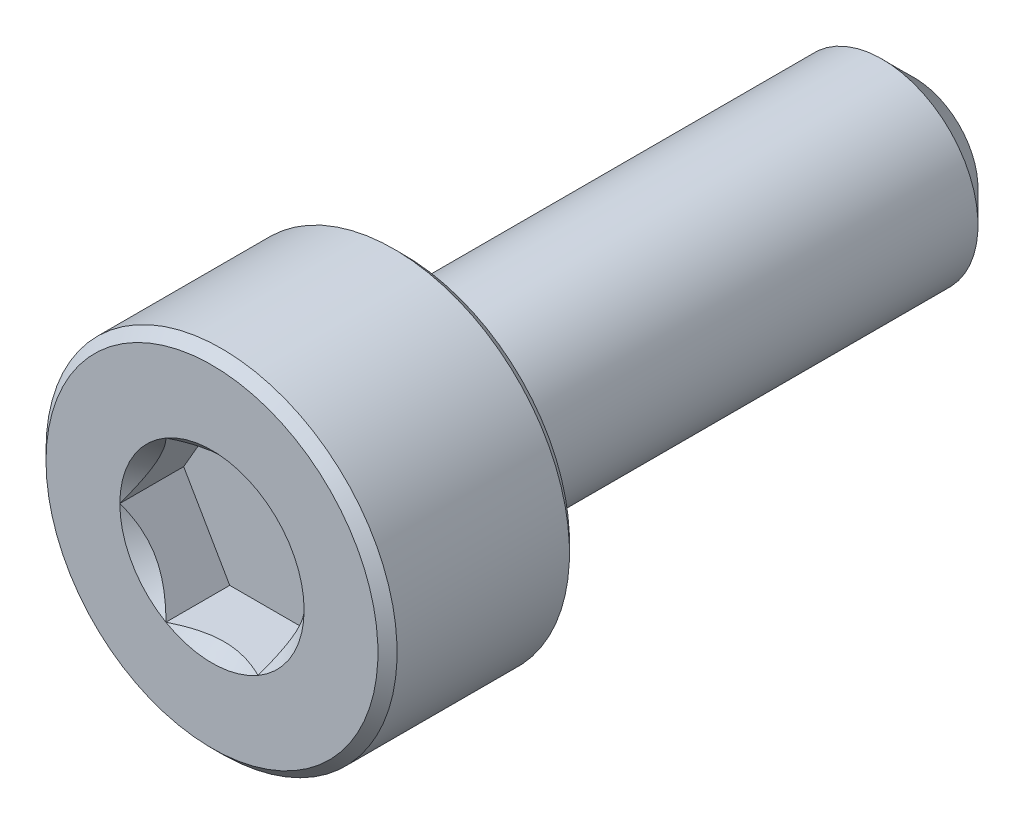
ISO-10303-21;
HEADER;
FILE_DESCRIPTION(('STEP AP214'),'2;1');
FILE_NAME('part.step','',(''),(''),'','','');
FILE_SCHEMA(('AUTOMOTIVE_DESIGN { 1 0 10303 214 1 1 1 1 }'));
ENDSEC;
DATA;
#1=APPLICATION_CONTEXT('core data for automotive mechanical design processes');
#2=APPLICATION_PROTOCOL_DEFINITION('international standard','automotive_design',2000,#1);
#3=PRODUCT_CONTEXT('',#1,'mechanical');
#4=PRODUCT('Part','Part','',(#3));
#5=PRODUCT_RELATED_PRODUCT_CATEGORY('part','',(#4));
#6=PRODUCT_DEFINITION_FORMATION('','',#4);
#7=PRODUCT_DEFINITION_CONTEXT('part definition',#1,'design');
#8=PRODUCT_DEFINITION('design','',#6,#7);
#9=PRODUCT_DEFINITION_SHAPE('','',#8);
#10=(LENGTH_UNIT() NAMED_UNIT(*) SI_UNIT(.MILLI.,.METRE.));
#11=(NAMED_UNIT(*) PLANE_ANGLE_UNIT() SI_UNIT($,.RADIAN.));
#12=(NAMED_UNIT(*) SI_UNIT($,.STERADIAN.) SOLID_ANGLE_UNIT());
#13=UNCERTAINTY_MEASURE_WITH_UNIT(LENGTH_MEASURE(1.E-05),#10,'distance_accuracy_value','');
#14=(GEOMETRIC_REPRESENTATION_CONTEXT(3) GLOBAL_UNCERTAINTY_ASSIGNED_CONTEXT((#13)) GLOBAL_UNIT_ASSIGNED_CONTEXT((#10,
#11,#12)) REPRESENTATION_CONTEXT('',''));
#15=CARTESIAN_POINT('',(0.,0.,0.));
#16=DIRECTION('',(0.,0.,1.));
#17=DIRECTION('',(1.,0.,0.));
#18=AXIS2_PLACEMENT_3D('',#15,#16,#17);
#19=CARTESIAN_POINT('',(0.,2.6,5.5));
#20=DIRECTION('',(0.,0.,1.));
#21=DIRECTION('',(1.,0.,0.));
#22=AXIS2_PLACEMENT_3D('',#19,#20,#21);
#23=PLANE('',#22);
#24=CARTESIAN_POINT('',(0.,0.,5.5));
#25=DIRECTION('',(0.,0.,1.));
#26=DIRECTION('',(1.,0.,0.));
#27=AXIS2_PLACEMENT_3D('',#24,#25,#26);
#28=CIRCLE('',#27,1.44337567297406);
#29=CARTESIAN_POINT('',(1.44337567297406,0.,5.5));
#30=VERTEX_POINT('',#29);
#31=CARTESIAN_POINT('',(0.721687836487031,1.25,5.5));
#32=VERTEX_POINT('',#31);
#33=EDGE_CURVE('E97',#30,#32,#28,.T.);
#34=ORIENTED_EDGE('',*,*,#33,.F.);
#35=CARTESIAN_POINT('',(0.721687836487031,-1.25,5.5));
#36=VERTEX_POINT('',#35);
#37=EDGE_CURVE('E57',#36,#30,#28,.T.);
#38=ORIENTED_EDGE('',*,*,#37,.F.);
#39=CARTESIAN_POINT('',(-0.721687836487033,-1.25,5.5));
#40=VERTEX_POINT('',#39);
#41=EDGE_CURVE('E300',#40,#36,#28,.T.);
#42=ORIENTED_EDGE('',*,*,#41,.F.);
#43=CARTESIAN_POINT('',(-1.44337567297406,0.,5.5));
#44=VERTEX_POINT('',#43);
#45=EDGE_CURVE('E64',#44,#40,#28,.T.);
#46=ORIENTED_EDGE('',*,*,#45,.F.);
#47=CARTESIAN_POINT('',(-0.721687836487031,1.25,5.5));
#48=VERTEX_POINT('',#47);
#49=EDGE_CURVE('E132',#48,#44,#28,.T.);
#50=ORIENTED_EDGE('',*,*,#49,.F.);
#51=EDGE_CURVE('E106',#32,#48,#28,.T.);
#52=ORIENTED_EDGE('',*,*,#51,.F.);
#53=EDGE_LOOP('',(#34,#38,#42,#46,#50,#52));
#54=FACE_BOUND('',#53,.T.);
#55=CARTESIAN_POINT('',(0.,0.,5.5));
#56=DIRECTION('',(0.,0.,-1.));
#57=DIRECTION('',(-1.,0.,0.));
#58=AXIS2_PLACEMENT_3D('',#55,#56,#57);
#59=CIRCLE('',#58,2.6);
#60=CARTESIAN_POINT('',(-2.6,0.,5.5));
#61=VERTEX_POINT('',#60);
#62=EDGE_CURVE('E51',#61,#61,#59,.T.);
#63=ORIENTED_EDGE('',*,*,#62,.F.);
#64=EDGE_LOOP('',(#63));
#65=FACE_BOUND('',#64,.T.);
#66=ADVANCED_FACE('F38',(#54,#65),#23,.T.);
#67=CARTESIAN_POINT('',(0.,0.,5.35));
#68=DIRECTION('',(0.,0.,-1.));
#69=DIRECTION('',(-1.,0.,0.));
#70=AXIS2_PLACEMENT_3D('',#67,#68,#69);
#71=CONICAL_SURFACE('',#70,2.75,0.785398163397445);
#72=ORIENTED_EDGE('',*,*,#62,.T.);
#73=EDGE_LOOP('',(#72));
#74=FACE_BOUND('',#73,.T.);
#75=CARTESIAN_POINT('',(0.,0.,5.35));
#76=DIRECTION('',(0.,0.,-1.));
#77=DIRECTION('',(-1.,0.,0.));
#78=AXIS2_PLACEMENT_3D('',#75,#76,#77);
#79=CIRCLE('',#78,2.75);
#80=CARTESIAN_POINT('',(-2.75,0.,5.35));
#81=VERTEX_POINT('',#80);
#82=EDGE_CURVE('E275',#81,#81,#79,.T.);
#83=ORIENTED_EDGE('',*,*,#82,.F.);
#84=EDGE_LOOP('',(#83));
#85=FACE_BOUND('',#84,.T.);
#86=ADVANCED_FACE('F196',(#74,#85),#71,.T.);
#87=CARTESIAN_POINT('',(0.,0.,-5.5));
#88=DIRECTION('',(0.,0.,-1.));
#89=DIRECTION('',(-1.,0.,0.));
#90=AXIS2_PLACEMENT_3D('',#87,#88,#89);
#91=CYLINDRICAL_SURFACE('',#90,2.75);
#92=ORIENTED_EDGE('',*,*,#82,.T.);
#93=EDGE_LOOP('',(#92));
#94=FACE_BOUND('',#93,.T.);
#95=CARTESIAN_POINT('',(0.,0.,2.65));
#96=DIRECTION('',(0.,0.,-1.));
#97=DIRECTION('',(-1.,0.,0.));
#98=AXIS2_PLACEMENT_3D('',#95,#96,#97);
#99=CIRCLE('',#98,2.75);
#100=CARTESIAN_POINT('',(-2.75,0.,2.65));
#101=VERTEX_POINT('',#100);
#102=EDGE_CURVE('E272',#101,#101,#99,.T.);
#103=ORIENTED_EDGE('',*,*,#102,.F.);
#104=EDGE_LOOP('',(#103));
#105=FACE_BOUND('',#104,.T.);
#106=ADVANCED_FACE('F200',(#94,#105),#91,.T.);
#107=CARTESIAN_POINT('',(0.,0.,2.5));
#108=DIRECTION('',(0.,0.,1.));
#109=DIRECTION('',(1.,0.,0.));
#110=AXIS2_PLACEMENT_3D('',#107,#108,#109);
#111=CONICAL_SURFACE('',#110,2.6,0.785398163397445);
#112=ORIENTED_EDGE('',*,*,#102,.T.);
#113=EDGE_LOOP('',(#112));
#114=FACE_BOUND('',#113,.T.);
#115=CARTESIAN_POINT('',(0.,0.,2.5));
#116=DIRECTION('',(0.,0.,-1.));
#117=DIRECTION('',(-1.,0.,0.));
#118=AXIS2_PLACEMENT_3D('',#115,#116,#117);
#119=CIRCLE('',#118,2.6);
#120=CARTESIAN_POINT('',(-2.6,0.,2.5));
#121=VERTEX_POINT('',#120);
#122=EDGE_CURVE('E269',#121,#121,#119,.T.);
#123=ORIENTED_EDGE('',*,*,#122,.F.);
#124=EDGE_LOOP('',(#123));
#125=FACE_BOUND('',#124,.T.);
#126=ADVANCED_FACE('F205',(#114,#125),#111,.T.);
#127=CARTESIAN_POINT('',(0.,2.6,2.5));
#128=DIRECTION('',(0.,0.,-1.));
#129=DIRECTION('',(-1.,0.,0.));
#130=AXIS2_PLACEMENT_3D('',#127,#128,#129);
#131=PLANE('',#130);
#132=ORIENTED_EDGE('',*,*,#122,.T.);
#133=EDGE_LOOP('',(#132));
#134=FACE_BOUND('',#133,.T.);
#135=CARTESIAN_POINT('',(0.,0.,2.5));
#136=DIRECTION('',(0.,0.,-1.));
#137=DIRECTION('',(-1.,0.,0.));
#138=AXIS2_PLACEMENT_3D('',#135,#136,#137);
#139=CIRCLE('',#138,1.5);
#140=CARTESIAN_POINT('',(-1.5,0.,2.5));
#141=VERTEX_POINT('',#140);
#142=EDGE_CURVE('E266',#141,#141,#139,.T.);
#143=ORIENTED_EDGE('',*,*,#142,.F.);
#144=EDGE_LOOP('',(#143));
#145=FACE_BOUND('',#144,.T.);
#146=ADVANCED_FACE('F213',(#134,#145),#131,.T.);
#147=CARTESIAN_POINT('',(0.,0.,-5.5));
#148=DIRECTION('',(0.,0.,-1.));
#149=DIRECTION('',(-1.,0.,0.));
#150=AXIS2_PLACEMENT_3D('',#147,#148,#149);
#151=CYLINDRICAL_SURFACE('',#150,1.5);
#152=ORIENTED_EDGE('',*,*,#142,.T.);
#153=EDGE_LOOP('',(#152));
#154=FACE_BOUND('',#153,.T.);
#155=CARTESIAN_POINT('',(0.,0.,-4.99999999999999));
#156=DIRECTION('',(0.,0.,-1.));
#157=DIRECTION('',(-1.,0.,0.));
#158=AXIS2_PLACEMENT_3D('',#155,#156,#157);
#159=CIRCLE('',#158,1.5);
#160=CARTESIAN_POINT('',(-1.5,0.,-4.99999999999999));
#161=VERTEX_POINT('',#160);
#162=EDGE_CURVE('E263',#161,#161,#159,.T.);
#163=ORIENTED_EDGE('',*,*,#162,.F.);
#164=EDGE_LOOP('',(#163));
#165=FACE_BOUND('',#164,.T.);
#166=ADVANCED_FACE('F217',(#154,#165),#151,.T.);
#167=CARTESIAN_POINT('',(0.,0.,-5.5));
#168=DIRECTION('',(0.,0.,1.));
#169=DIRECTION('',(1.,0.,0.));
#170=AXIS2_PLACEMENT_3D('',#167,#168,#169);
#171=CONICAL_SURFACE('',#170,1.,0.785398163397443);
#172=ORIENTED_EDGE('',*,*,#162,.T.);
#173=EDGE_LOOP('',(#172));
#174=FACE_BOUND('',#173,.T.);
#175=CARTESIAN_POINT('',(0.,0.,-5.5));
#176=DIRECTION('',(0.,0.,-1.));
#177=DIRECTION('',(-1.,0.,0.));
#178=AXIS2_PLACEMENT_3D('',#175,#176,#177);
#179=CIRCLE('',#178,1.);
#180=CARTESIAN_POINT('',(-1.,0.,-5.5));
#181=VERTEX_POINT('',#180);
#182=EDGE_CURVE('E245',#181,#181,#179,.T.);
#183=ORIENTED_EDGE('',*,*,#182,.F.);
#184=EDGE_LOOP('',(#183));
#185=FACE_BOUND('',#184,.T.);
#186=ADVANCED_FACE('F221',(#174,#185),#171,.T.);
#187=CARTESIAN_POINT('',(0.,1.,-5.5));
#188=DIRECTION('',(0.,0.,-1.));
#189=DIRECTION('',(-1.,0.,0.));
#190=AXIS2_PLACEMENT_3D('',#187,#188,#189);
#191=PLANE('',#190);
#192=ORIENTED_EDGE('',*,*,#182,.T.);
#193=EDGE_LOOP('',(#192));
#194=FACE_BOUND('',#193,.T.);
#195=ADVANCED_FACE('F225',(#194),#191,.T.);
#196=CARTESIAN_POINT('',(0.,0.,5.5));
#197=DIRECTION('',(0.,0.,1.));
#198=DIRECTION('',(1.,0.,0.));
#199=AXIS2_PLACEMENT_3D('',#196,#197,#198);
#200=CONICAL_SURFACE('',#199,1.44337567297406,0.78539816339745);
#201=ORIENTED_EDGE('',*,*,#51,.T.);
#202=CARTESIAN_POINT('',(-1.38510181874982,1.25,5.92237003539674));
#203=CARTESIAN_POINT('',(-1.3511198664462,1.25,5.89714624516244));
#204=CARTESIAN_POINT('',(-1.31694282655271,1.25,5.87218595606241));
#205=CARTESIAN_POINT('',(-1.24812142569207,1.25,5.82289946364711));
#206=CARTESIAN_POINT('',(-1.21347694388891,1.25,5.7985734292472));
#207=CARTESIAN_POINT('',(-1.10822083190006,1.25,5.72636172296323));
#208=CARTESIAN_POINT('',(-1.0368031370095,1.25,5.67963105585342));
#209=CARTESIAN_POINT('',(-0.887382773604422,1.25,5.58837288370571));
#210=CARTESIAN_POINT('',(-0.809230859559387,1.25,5.54408680019188));
#211=CARTESIAN_POINT('',(-0.649095969048192,1.25,5.46341771967474));
#212=CARTESIAN_POINT('',(-0.567127025311257,1.25,5.42700818355541));
#213=CARTESIAN_POINT('',(-0.443557329124525,1.25,5.38248253752399));
#214=CARTESIAN_POINT('',(-0.403672751095206,1.25,5.36961750878661));
#215=CARTESIAN_POINT('',(-0.322988211495524,1.25,5.34709732587493));
#216=CARTESIAN_POINT('',(-0.282188182544569,1.25,5.3374424088096));
#217=CARTESIAN_POINT('',(-0.200572984829334,1.25,5.32199119628927));
#218=CARTESIAN_POINT('',(-0.159769911270982,1.25,5.31613197729548));
#219=CARTESIAN_POINT('',(-0.0777868297167925,1.25,5.30837795442431));
#220=CARTESIAN_POINT('',(-0.0366068776776866,1.25,5.30648257131138));
#221=CARTESIAN_POINT('',(0.044468300338807,1.25,5.30677812948321));
#222=CARTESIAN_POINT('',(0.0843640386448807,1.25,5.3088450344818));
#223=CARTESIAN_POINT('',(0.16379054813703,1.25,5.31668957033969));
#224=CARTESIAN_POINT('',(0.203321244417683,1.25,5.32246794634046));
#225=CARTESIAN_POINT('',(0.282393987539772,1.25,5.33752741705993));
#226=CARTESIAN_POINT('',(0.321924895820598,1.25,5.34686615718743));
#227=CARTESIAN_POINT('',(0.400129026379049,1.25,5.36856655366507));
#228=CARTESIAN_POINT('',(0.438802337754634,1.25,5.38092789436938));
#229=CARTESIAN_POINT('',(0.563172797994067,1.25,5.42526147510656));
#230=CARTESIAN_POINT('',(0.647028634884197,1.25,5.46238856151275));
#231=CARTESIAN_POINT('',(0.810774513742064,1.25,5.54485212171168));
#232=CARTESIAN_POINT('',(0.890648634134941,1.25,5.59021863514241));
#233=CARTESIAN_POINT('',(1.04325497380786,1.25,5.68372168049333));
#234=CARTESIAN_POINT('',(1.11614441754118,1.25,5.73160472363706));
#235=CARTESIAN_POINT('',(1.22353403061444,1.25,5.8055883961688));
#236=CARTESIAN_POINT('',(1.25886568278664,1.25,5.83050307518733));
#237=CARTESIAN_POINT('',(1.32904842602817,1.25,5.8809811787098));
#238=CARTESIAN_POINT('',(1.36389964521094,1.25,5.90654442489043));
#239=CARTESIAN_POINT('',(1.39855118522491,1.25,5.93237628762573));
#240=B_SPLINE_CURVE_WITH_KNOTS('',3,(#202,#203,#204,#205,#206,#207,#208,#209,#210,#211,#212,
#213,#214,#215,#216,#217,#218,#219,#220,#221,#222,#223,#224,#225,#226,#227,#228,#229,#230,#231,
#232,#233,#234,#235,#236,#237,#238,#239),.UNSPECIFIED.,.F.,.F.,(4,2,2,2,2,2,2,2,2,2,2,2,2,2,2,2,
2,2,4),(0.,0.126957685716233,0.253948844536467,0.509869207561396,0.779115442456376,
1.04743984385779,1.17305649104353,1.29868241461005,1.42216852508156,1.54563658925964,
1.66530259813563,1.78499263952808,1.90670905530249,2.0284127658315,2.30272027123448,
2.57804870180744,2.83955157020837,2.96924487037104,3.0989028897939),.UNSPECIFIED.);
#241=EDGE_CURVE('E12',#32,#48,#240,.F.);
#242=ORIENTED_EDGE('',*,*,#241,.F.);
#243=EDGE_LOOP('',(#201,#242));
#244=FACE_BOUND('',#243,.T.);
#245=ADVANCED_FACE('F110',(#244),#200,.F.);
#246=ORIENTED_EDGE('',*,*,#49,.T.);
#247=CARTESIAN_POINT('',(-0.721572366433194,1.2502,5.50011548390914));
#248=CARTESIAN_POINT('',(-0.746384090710444,1.20722483292841,5.4753216680551));
#249=CARTESIAN_POINT('',(-0.771610739653664,1.16353099525405,5.45198373441868));
#250=CARTESIAN_POINT('',(-0.823050873919154,1.07443406915806,5.40925200408454));
#251=CARTESIAN_POINT('',(-0.849269254648333,1.02902250164294,5.38988199236041));
#252=CARTESIAN_POINT('',(-0.902137405038635,0.937452179064741,5.35670048341348));
#253=CARTESIAN_POINT('',(-0.928773701756387,0.891316759824116,5.34280555905266));
#254=CARTESIAN_POINT('',(-0.982632884076012,0.798029919592409,5.32139728216064));
#255=CARTESIAN_POINT('',(-1.00985412292348,0.750881350863622,5.31386794156679));
#256=CARTESIAN_POINT('',(-1.05676666578643,0.66962644311275,5.3070744980507));
#257=CARTESIAN_POINT('',(-1.07639733689152,0.635625123372061,5.30606855910435));
#258=CARTESIAN_POINT('',(-1.11562418145499,0.567682235567525,5.30776141491132));
#259=CARTESIAN_POINT('',(-1.1352203463451,0.533740682344345,5.31046102721554));
#260=CARTESIAN_POINT('',(-1.1742235548576,0.466185143542503,5.31940893031638));
#261=CARTESIAN_POINT('',(-1.19363040521232,0.432571492713227,5.32566052589971));
#262=CARTESIAN_POINT('',(-1.23212011385119,0.365905361782189,5.3413756814139));
#263=CARTESIAN_POINT('',(-1.2512028293628,0.332853128969707,5.35084062008746));
#264=CARTESIAN_POINT('',(-1.30007715810653,0.248200308399738,5.37893139068759));
#265=CARTESIAN_POINT('',(-1.32956058931202,0.197133507570364,5.3996701574522));
#266=CARTESIAN_POINT('',(-1.38737318998519,0.0969991458867465,5.44638713467148));
#267=CARTESIAN_POINT('',(-1.41570576386268,0.0479256884217316,5.47234829594677));
#268=CARTESIAN_POINT('',(-1.4434911430279,-0.000199999999999488,5.50011548390914));
#269=B_SPLINE_CURVE_WITH_KNOTS('',3,(#247,#248,#249,#250,#251,#252,#253,#254,#255,#256,#257,
#258,#259,#260,#261,#262,#263,#264,#265,#266,#267,#268),.UNSPECIFIED.,.F.,.F.,(4,2,2,2,2,2,2,2,
2,2,4),(0.,0.166533409618303,0.334037607289761,0.498880396489697,0.663307919240272,
0.780963963458824,0.89864597014845,1.01643764860773,1.13427993171549,1.32148652032141,
1.50809158792573),.UNSPECIFIED.);
#270=EDGE_CURVE('E105',#48,#44,#269,.T.);
#271=ORIENTED_EDGE('',*,*,#270,.F.);
#272=EDGE_LOOP('',(#246,#271));
#273=FACE_BOUND('',#272,.T.);
#274=ADVANCED_FACE('F308',(#273),#200,.F.);
#275=ORIENTED_EDGE('',*,*,#45,.T.);
#276=CARTESIAN_POINT('',(-1.4434911430279,0.000200000000000513,5.50011548390914));
#277=CARTESIAN_POINT('',(-1.41867941875065,-0.0427751670715862,5.4753216680551));
#278=CARTESIAN_POINT('',(-1.39345276980743,-0.0864690047459475,5.45198373441868));
#279=CARTESIAN_POINT('',(-1.34201263554194,-0.175565930841941,5.40925200408454));
#280=CARTESIAN_POINT('',(-1.31579425481276,-0.220977498357064,5.38988199236041));
#281=CARTESIAN_POINT('',(-1.26292610442246,-0.312547820935259,5.35670048341348));
#282=CARTESIAN_POINT('',(-1.23628980770471,-0.358683240175885,5.34280555905266));
#283=CARTESIAN_POINT('',(-1.18243062538508,-0.451970080407592,5.32139728216064));
#284=CARTESIAN_POINT('',(-1.15520938653761,-0.499118649136379,5.31386794156679));
#285=CARTESIAN_POINT('',(-1.10829684367467,-0.580373556887252,5.3070744980507));
#286=CARTESIAN_POINT('',(-1.08866617256958,-0.614374876627941,5.30606855910435));
#287=CARTESIAN_POINT('',(-1.04943932800611,-0.682317764432477,5.30776141491132));
#288=CARTESIAN_POINT('',(-1.02984316311599,-0.716259317655657,5.31046102721554));
#289=CARTESIAN_POINT('',(-0.990839954603499,-0.783814856457499,5.31940893031638));
#290=CARTESIAN_POINT('',(-0.971433104248771,-0.817428507286775,5.32566052589971));
#291=CARTESIAN_POINT('',(-0.932943395609905,-0.884094638217813,5.3413756814139));
#292=CARTESIAN_POINT('',(-0.913860680098301,-0.917146871030295,5.35084062008746));
#293=CARTESIAN_POINT('',(-0.864986351354568,-1.00179969160026,5.37893139068759));
#294=CARTESIAN_POINT('',(-0.835502920149076,-1.05286649242964,5.3996701574522));
#295=CARTESIAN_POINT('',(-0.777690319475909,-1.15300085411325,5.44638713467148));
#296=CARTESIAN_POINT('',(-0.749357745598417,-1.20207431157827,5.47234829594677));
#297=CARTESIAN_POINT('',(-0.721572366433195,-1.2502,5.50011548390914));
#298=B_SPLINE_CURVE_WITH_KNOTS('',3,(#276,#277,#278,#279,#280,#281,#282,#283,#284,#285,#286,
#287,#288,#289,#290,#291,#292,#293,#294,#295,#296,#297),.UNSPECIFIED.,.F.,.F.,(4,2,2,2,2,2,2,2,
2,2,4),(0.,0.166533409618304,0.334037607289762,0.498880396489698,0.663307919240275,
0.780963963458827,0.898645970148453,1.01643764860773,1.1342799317155,1.32148652032141,
1.50809158792573),.UNSPECIFIED.);
#299=EDGE_CURVE('E141',#44,#40,#298,.T.);
#300=ORIENTED_EDGE('',*,*,#299,.F.);
#301=EDGE_LOOP('',(#275,#300));
#302=FACE_BOUND('',#301,.T.);
#303=ADVANCED_FACE('F303',(#302),#200,.F.);
#304=ORIENTED_EDGE('',*,*,#41,.T.);
#305=CARTESIAN_POINT('',(-1.38510181874983,-1.25,5.92237003539674));
#306=CARTESIAN_POINT('',(-1.3511198664462,-1.25,5.89714624516244));
#307=CARTESIAN_POINT('',(-1.31694282655271,-1.25,5.87218595606241));
#308=CARTESIAN_POINT('',(-1.24812142569207,-1.25,5.82289946364711));
#309=CARTESIAN_POINT('',(-1.21347694388891,-1.25,5.7985734292472));
#310=CARTESIAN_POINT('',(-1.10822083190006,-1.25,5.72636172296323));
#311=CARTESIAN_POINT('',(-1.0368031370095,-1.25,5.67963105585342));
#312=CARTESIAN_POINT('',(-0.887382773604422,-1.25,5.58837288370571));
#313=CARTESIAN_POINT('',(-0.809230859559387,-1.25,5.54408680019187));
#314=CARTESIAN_POINT('',(-0.649095969048193,-1.25,5.46341771967474));
#315=CARTESIAN_POINT('',(-0.567127025311257,-1.25,5.42700818355541));
#316=CARTESIAN_POINT('',(-0.443557329124525,-1.25,5.38248253752399));
#317=CARTESIAN_POINT('',(-0.403672751095206,-1.25,5.36961750878661));
#318=CARTESIAN_POINT('',(-0.322988211495524,-1.25,5.34709732587493));
#319=CARTESIAN_POINT('',(-0.28218818254457,-1.25,5.33744240880959));
#320=CARTESIAN_POINT('',(-0.200572984829335,-1.25,5.32199119628927));
#321=CARTESIAN_POINT('',(-0.159769911270982,-1.25,5.31613197729548));
#322=CARTESIAN_POINT('',(-0.077786829716793,-1.25,5.30837795442431));
#323=CARTESIAN_POINT('',(-0.0366068776776871,-1.25,5.30648257131138));
#324=CARTESIAN_POINT('',(0.0444683003388065,-1.25,5.30677812948321));
#325=CARTESIAN_POINT('',(0.0843640386448802,-1.25,5.3088450344818));
#326=CARTESIAN_POINT('',(0.16379054813703,-1.25,5.31668957033969));
#327=CARTESIAN_POINT('',(0.203321244417683,-1.25,5.32246794634046));
#328=CARTESIAN_POINT('',(0.282393987539771,-1.25,5.33752741705993));
#329=CARTESIAN_POINT('',(0.321924895820597,-1.25,5.34686615718743));
#330=CARTESIAN_POINT('',(0.400129026379048,-1.25,5.36856655366507));
#331=CARTESIAN_POINT('',(0.438802337754633,-1.25,5.38092789436938));
#332=CARTESIAN_POINT('',(0.563172797994066,-1.25,5.42526147510656));
#333=CARTESIAN_POINT('',(0.647028634884195,-1.25,5.46238856151275));
#334=CARTESIAN_POINT('',(0.810774513742062,-1.25,5.54485212171168));
#335=CARTESIAN_POINT('',(0.890648634134939,-1.25,5.5902186351424));
#336=CARTESIAN_POINT('',(1.04325497380785,-1.25,5.68372168049333));
#337=CARTESIAN_POINT('',(1.11614441754118,-1.25,5.73160472363706));
#338=CARTESIAN_POINT('',(1.22353403061444,-1.25,5.8055883961688));
#339=CARTESIAN_POINT('',(1.25886568278664,-1.25,5.83050307518733));
#340=CARTESIAN_POINT('',(1.32904842602817,-1.25,5.8809811787098));
#341=CARTESIAN_POINT('',(1.36389964521094,-1.25,5.90654442489043));
#342=CARTESIAN_POINT('',(1.3985511852249,-1.25,5.93237628762573));
#343=B_SPLINE_CURVE_WITH_KNOTS('',3,(#305,#306,#307,#308,#309,#310,#311,#312,#313,#314,#315,
#316,#317,#318,#319,#320,#321,#322,#323,#324,#325,#326,#327,#328,#329,#330,#331,#332,#333,#334,
#335,#336,#337,#338,#339,#340,#341,#342),.UNSPECIFIED.,.F.,.F.,(4,2,2,2,2,2,2,2,2,2,2,2,2,2,2,2,
2,2,4),(0.,0.126957685716233,0.253948844536467,0.509869207561397,0.779115442456378,
1.04743984385779,1.17305649104353,1.29868241461005,1.42216852508156,1.54563658925964,
1.66530259813563,1.78499263952808,1.90670905530249,2.0284127658315,2.30272027123448,
2.57804870180744,2.83955157020837,2.96924487037104,3.0989028897939),.UNSPECIFIED.);
#344=EDGE_CURVE('E161',#40,#36,#343,.T.);
#345=ORIENTED_EDGE('',*,*,#344,.F.);
#346=EDGE_LOOP('',(#304,#345));
#347=FACE_BOUND('',#346,.T.);
#348=ADVANCED_FACE('F301',(#347),#200,.F.);
#349=ORIENTED_EDGE('',*,*,#37,.T.);
#350=CARTESIAN_POINT('',(0.721572366433193,-1.2502,5.50011548390914));
#351=CARTESIAN_POINT('',(0.746384090710443,-1.20722483292841,5.4753216680551));
#352=CARTESIAN_POINT('',(0.771610739653663,-1.16353099525405,5.45198373441868));
#353=CARTESIAN_POINT('',(0.823050873919153,-1.07443406915806,5.40925200408454));
#354=CARTESIAN_POINT('',(0.849269254648332,-1.02902250164294,5.38988199236041));
#355=CARTESIAN_POINT('',(0.902137405038634,-0.93745217906474,5.35670048341348));
#356=CARTESIAN_POINT('',(0.928773701756385,-0.891316759824115,5.34280555905266));
#357=CARTESIAN_POINT('',(0.982632884076011,-0.798029919592408,5.32139728216064));
#358=CARTESIAN_POINT('',(1.00985412292348,-0.750881350863621,5.31386794156679));
#359=CARTESIAN_POINT('',(1.05676666578643,-0.669626443112749,5.3070744980507));
#360=CARTESIAN_POINT('',(1.07639733689152,-0.63562512337206,5.30606855910435));
#361=CARTESIAN_POINT('',(1.11562418145498,-0.567682235567524,5.30776141491132));
#362=CARTESIAN_POINT('',(1.1352203463451,-0.533740682344344,5.31046102721554));
#363=CARTESIAN_POINT('',(1.1742235548576,-0.466185143542502,5.31940893031638));
#364=CARTESIAN_POINT('',(1.19363040521232,-0.432571492713226,5.32566052589971));
#365=CARTESIAN_POINT('',(1.23212011385119,-0.365905361782188,5.3413756814139));
#366=CARTESIAN_POINT('',(1.25120282936279,-0.332853128969706,5.35084062008746));
#367=CARTESIAN_POINT('',(1.30007715810653,-0.248200308399737,5.37893139068759));
#368=CARTESIAN_POINT('',(1.32956058931202,-0.197133507570362,5.3996701574522));
#369=CARTESIAN_POINT('',(1.38737318998519,-0.096999145886745,5.44638713467147));
#370=CARTESIAN_POINT('',(1.41570576386268,-0.0479256884217301,5.47234829594676));
#371=CARTESIAN_POINT('',(1.4434911430279,0.00020000000000041,5.50011548390914));
#372=B_SPLINE_CURVE_WITH_KNOTS('',3,(#350,#351,#352,#353,#354,#355,#356,#357,#358,#359,#360,
#361,#362,#363,#364,#365,#366,#367,#368,#369,#370,#371),.UNSPECIFIED.,.F.,.F.,(4,2,2,2,2,2,2,2,
2,2,4),(0.,0.166533409618303,0.33403760728976,0.498880396489697,0.663307919240272,
0.780963963458824,0.89864597014845,1.01643764860773,1.13427993171549,1.32148652032141,
1.50809158792574),.UNSPECIFIED.);
#373=EDGE_CURVE('E122',#36,#30,#372,.T.);
#374=ORIENTED_EDGE('',*,*,#373,.F.);
#375=EDGE_LOOP('',(#349,#374));
#376=FACE_BOUND('',#375,.T.);
#377=ADVANCED_FACE('F154',(#376),#200,.F.);
#378=ORIENTED_EDGE('',*,*,#33,.T.);
#379=CARTESIAN_POINT('',(1.4434911430279,-0.000199999999999486,5.50011548390914));
#380=CARTESIAN_POINT('',(1.41867941875065,0.0427751670715871,5.4753216680551));
#381=CARTESIAN_POINT('',(1.39345276980743,0.0864690047459483,5.45198373441868));
#382=CARTESIAN_POINT('',(1.34201263554194,0.175565930841942,5.40925200408454));
#383=CARTESIAN_POINT('',(1.31579425481276,0.220977498357064,5.38988199236041));
#384=CARTESIAN_POINT('',(1.26292610442246,0.31254782093526,5.35670048341348));
#385=CARTESIAN_POINT('',(1.23628980770471,0.358683240175885,5.34280555905266));
#386=CARTESIAN_POINT('',(1.18243062538508,0.451970080407592,5.32139728216064));
#387=CARTESIAN_POINT('',(1.15520938653761,0.499118649136379,5.31386794156679));
#388=CARTESIAN_POINT('',(1.10829684367467,0.580373556887252,5.3070744980507));
#389=CARTESIAN_POINT('',(1.08866617256958,0.61437487662794,5.30606855910435));
#390=CARTESIAN_POINT('',(1.04943932800611,0.682317764432477,5.30776141491132));
#391=CARTESIAN_POINT('',(1.02984316311599,0.716259317655657,5.31046102721554));
#392=CARTESIAN_POINT('',(0.990839954603499,0.783814856457499,5.31940893031638));
#393=CARTESIAN_POINT('',(0.971433104248771,0.817428507286774,5.32566052589971));
#394=CARTESIAN_POINT('',(0.932943395609905,0.884094638217812,5.3413756814139));
#395=CARTESIAN_POINT('',(0.913860680098301,0.917146871030295,5.35084062008746));
#396=CARTESIAN_POINT('',(0.864986351354568,1.00179969160026,5.37893139068759));
#397=CARTESIAN_POINT('',(0.835502920149076,1.05286649242964,5.3996701574522));
#398=CARTESIAN_POINT('',(0.777690319475908,1.15300085411325,5.44638713467148));
#399=CARTESIAN_POINT('',(0.749357745598417,1.20207431157827,5.47234829594677));
#400=CARTESIAN_POINT('',(0.721572366433194,1.2502,5.50011548390914));
#401=B_SPLINE_CURVE_WITH_KNOTS('',3,(#379,#380,#381,#382,#383,#384,#385,#386,#387,#388,#389,
#390,#391,#392,#393,#394,#395,#396,#397,#398,#399,#400),.UNSPECIFIED.,.F.,.F.,(4,2,2,2,2,2,2,2,
2,2,4),(0.,0.166533409618303,0.334037607289761,0.498880396489697,0.663307919240273,
0.780963963458825,0.898645970148452,1.01643764860773,1.13427993171549,1.32148652032141,
1.50809158792573),.UNSPECIFIED.);
#402=EDGE_CURVE('E101',#30,#32,#401,.T.);
#403=ORIENTED_EDGE('',*,*,#402,.F.);
#404=EDGE_LOOP('',(#378,#403));
#405=FACE_BOUND('',#404,.T.);
#406=ADVANCED_FACE('F99',(#405),#200,.F.);
#407=CARTESIAN_POINT('',(0.,2.6,4.5));
#408=DIRECTION('',(0.,0.,1.));
#409=DIRECTION('',(1.,0.,0.));
#410=AXIS2_PLACEMENT_3D('',#407,#408,#409);
#411=PLANE('',#410);
#412=DIRECTION('',(0.5,-0.866025403784439,0.));
#413=VECTOR('',#412,1.);
#414=CARTESIAN_POINT('',(1.44337567297406,0.,4.5));
#415=LINE('',#414,#413);
#416=CARTESIAN_POINT('',(0.721687836487032,1.25,4.5));
#417=VERTEX_POINT('',#416);
#418=CARTESIAN_POINT('',(1.44337567297406,0.,4.5));
#419=VERTEX_POINT('',#418);
#420=EDGE_CURVE('E240',#417,#419,#415,.T.);
#421=ORIENTED_EDGE('',*,*,#420,.F.);
#422=DIRECTION('',(1.,0.,0.));
#423=VECTOR('',#422,1.);
#424=CARTESIAN_POINT('',(0.721687836487032,1.25,4.5));
#425=LINE('',#424,#423);
#426=CARTESIAN_POINT('',(-0.721687836487032,1.25,4.5));
#427=VERTEX_POINT('',#426);
#428=EDGE_CURVE('E126',#427,#417,#425,.T.);
#429=ORIENTED_EDGE('',*,*,#428,.F.);
#430=DIRECTION('',(0.5,0.866025403784439,0.));
#431=VECTOR('',#430,1.);
#432=CARTESIAN_POINT('',(-0.721687836487032,1.25,4.5));
#433=LINE('',#432,#431);
#434=CARTESIAN_POINT('',(-1.44337567297406,0.,4.5));
#435=VERTEX_POINT('',#434);
#436=EDGE_CURVE('E252',#435,#427,#433,.T.);
#437=ORIENTED_EDGE('',*,*,#436,.F.);
#438=DIRECTION('',(-0.5,0.866025403784439,0.));
#439=VECTOR('',#438,1.);
#440=CARTESIAN_POINT('',(-1.44337567297406,0.,4.5));
#441=LINE('',#440,#439);
#442=CARTESIAN_POINT('',(-0.721687836487033,-1.25,4.5));
#443=VERTEX_POINT('',#442);
#444=EDGE_CURVE('E291',#443,#435,#441,.T.);
#445=ORIENTED_EDGE('',*,*,#444,.F.);
#446=DIRECTION('',(-1.,0.,0.));
#447=VECTOR('',#446,1.);
#448=CARTESIAN_POINT('',(-0.721687836487033,-1.25,4.5));
#449=LINE('',#448,#447);
#450=CARTESIAN_POINT('',(0.721687836487031,-1.25,4.5));
#451=VERTEX_POINT('',#450);
#452=EDGE_CURVE('E247',#451,#443,#449,.T.);
#453=ORIENTED_EDGE('',*,*,#452,.F.);
#454=DIRECTION('',(-0.5,-0.866025403784439,0.));
#455=VECTOR('',#454,1.);
#456=CARTESIAN_POINT('',(0.721687836487031,-1.25,4.5));
#457=LINE('',#456,#455);
#458=EDGE_CURVE('E243',#419,#451,#457,.T.);
#459=ORIENTED_EDGE('',*,*,#458,.F.);
#460=EDGE_LOOP('',(#421,#429,#437,#445,#453,#459));
#461=FACE_BOUND('',#460,.T.);
#462=ADVANCED_FACE('F153',(#461),#411,.T.);
#463=CARTESIAN_POINT('',(0.721687836487032,1.25,-0.318813079129867));
#464=DIRECTION('',(0.,1.,0.));
#465=DIRECTION('',(0.,0.,1.));
#466=AXIS2_PLACEMENT_3D('',#463,#464,#465);
#467=PLANE('',#466);
#468=DIRECTION('',(0.,0.,1.));
#469=VECTOR('',#468,1.);
#470=CARTESIAN_POINT('',(0.721687836487032,1.25,-0.318813079129867));
#471=LINE('',#470,#469);
#472=EDGE_CURVE('E119',#417,#32,#471,.T.);
#473=ORIENTED_EDGE('',*,*,#472,.T.);
#474=ORIENTED_EDGE('',*,*,#241,.T.);
#475=DIRECTION('',(0.,0.,1.));
#476=VECTOR('',#475,1.);
#477=CARTESIAN_POINT('',(-0.721687836487032,1.25,-0.318813079129867));
#478=LINE('',#477,#476);
#479=EDGE_CURVE('E128',#427,#48,#478,.T.);
#480=ORIENTED_EDGE('',*,*,#479,.F.);
#481=ORIENTED_EDGE('',*,*,#428,.T.);
#482=EDGE_LOOP('',(#473,#474,#480,#481));
#483=FACE_BOUND('',#482,.T.);
#484=ADVANCED_FACE('F124',(#483),#467,.F.);
#485=CARTESIAN_POINT('',(-0.721687836487032,1.25,-0.318813079129867));
#486=DIRECTION('',(-0.866025403784438,0.5,0.));
#487=DIRECTION('',(-0.5,-0.866025403784439,0.));
#488=AXIS2_PLACEMENT_3D('',#485,#486,#487);
#489=PLANE('',#488);
#490=ORIENTED_EDGE('',*,*,#479,.T.);
#491=ORIENTED_EDGE('',*,*,#270,.T.);
#492=DIRECTION('',(0.,0.,1.));
#493=VECTOR('',#492,1.);
#494=CARTESIAN_POINT('',(-1.44337567297406,0.,-0.318813079129867));
#495=LINE('',#494,#493);
#496=EDGE_CURVE('E258',#435,#44,#495,.T.);
#497=ORIENTED_EDGE('',*,*,#496,.F.);
#498=ORIENTED_EDGE('',*,*,#436,.T.);
#499=EDGE_LOOP('',(#490,#491,#497,#498));
#500=FACE_BOUND('',#499,.T.);
#501=ADVANCED_FACE('F148',(#500),#489,.F.);
#502=CARTESIAN_POINT('',(-1.44337567297406,0.,-0.318813079129867));
#503=DIRECTION('',(-0.866025403784438,-0.5,0.));
#504=DIRECTION('',(0.5,-0.866025403784439,0.));
#505=AXIS2_PLACEMENT_3D('',#502,#503,#504);
#506=PLANE('',#505);
#507=ORIENTED_EDGE('',*,*,#496,.T.);
#508=ORIENTED_EDGE('',*,*,#299,.T.);
#509=DIRECTION('',(0.,0.,1.));
#510=VECTOR('',#509,1.);
#511=CARTESIAN_POINT('',(-0.721687836487033,-1.25,-0.318813079129867));
#512=LINE('',#511,#510);
#513=EDGE_CURVE('E255',#443,#40,#512,.T.);
#514=ORIENTED_EDGE('',*,*,#513,.F.);
#515=ORIENTED_EDGE('',*,*,#444,.T.);
#516=EDGE_LOOP('',(#507,#508,#514,#515));
#517=FACE_BOUND('',#516,.T.);
#518=ADVANCED_FACE('F185',(#517),#506,.F.);
#519=CARTESIAN_POINT('',(-0.721687836487033,-1.25,-0.318813079129867));
#520=DIRECTION('',(0.,-1.,0.));
#521=DIRECTION('',(1.,0.,0.));
#522=AXIS2_PLACEMENT_3D('',#519,#520,#521);
#523=PLANE('',#522);
#524=ORIENTED_EDGE('',*,*,#513,.T.);
#525=ORIENTED_EDGE('',*,*,#344,.T.);
#526=DIRECTION('',(0.,0.,1.));
#527=VECTOR('',#526,1.);
#528=CARTESIAN_POINT('',(0.721687836487031,-1.25,-0.318813079129867));
#529=LINE('',#528,#527);
#530=EDGE_CURVE('E253',#451,#36,#529,.T.);
#531=ORIENTED_EDGE('',*,*,#530,.F.);
#532=ORIENTED_EDGE('',*,*,#452,.T.);
#533=EDGE_LOOP('',(#524,#525,#531,#532));
#534=FACE_BOUND('',#533,.T.);
#535=ADVANCED_FACE('F181',(#534),#523,.F.);
#536=CARTESIAN_POINT('',(0.721687836487031,-1.25,-0.318813079129867));
#537=DIRECTION('',(0.866025403784438,-0.5,0.));
#538=DIRECTION('',(0.5,0.866025403784439,0.));
#539=AXIS2_PLACEMENT_3D('',#536,#537,#538);
#540=PLANE('',#539);
#541=ORIENTED_EDGE('',*,*,#530,.T.);
#542=ORIENTED_EDGE('',*,*,#373,.T.);
#543=DIRECTION('',(0.,0.,1.));
#544=VECTOR('',#543,1.);
#545=CARTESIAN_POINT('',(1.44337567297406,0.,-0.318813079129867));
#546=LINE('',#545,#544);
#547=EDGE_CURVE('E121',#419,#30,#546,.T.);
#548=ORIENTED_EDGE('',*,*,#547,.F.);
#549=ORIENTED_EDGE('',*,*,#458,.T.);
#550=EDGE_LOOP('',(#541,#542,#548,#549));
#551=FACE_BOUND('',#550,.T.);
#552=ADVANCED_FACE('F178',(#551),#540,.F.);
#553=CARTESIAN_POINT('',(1.44337567297406,0.,-0.318813079129867));
#554=DIRECTION('',(0.866025403784439,0.5,0.));
#555=DIRECTION('',(-0.5,0.866025403784439,0.));
#556=AXIS2_PLACEMENT_3D('',#553,#554,#555);
#557=PLANE('',#556);
#558=ORIENTED_EDGE('',*,*,#547,.T.);
#559=ORIENTED_EDGE('',*,*,#402,.T.);
#560=ORIENTED_EDGE('',*,*,#472,.F.);
#561=ORIENTED_EDGE('',*,*,#420,.T.);
#562=EDGE_LOOP('',(#558,#559,#560,#561));
#563=FACE_BOUND('',#562,.T.);
#564=ADVANCED_FACE('F118',(#563),#557,.F.);
#565=CLOSED_SHELL('',(#66,#86,#106,#126,#146,#166,#186,#195,#245,#274,#303,#348,#377,#406,#462,
#484,#501,#518,#535,#552,#564));
#566=MANIFOLD_SOLID_BREP('B2',#565);
#567=ADVANCED_BREP_SHAPE_REPRESENTATION('',(#18,#566),#14);
#568=SHAPE_DEFINITION_REPRESENTATION(#9,#567);
ENDSEC;
END-ISO-10303-21;
